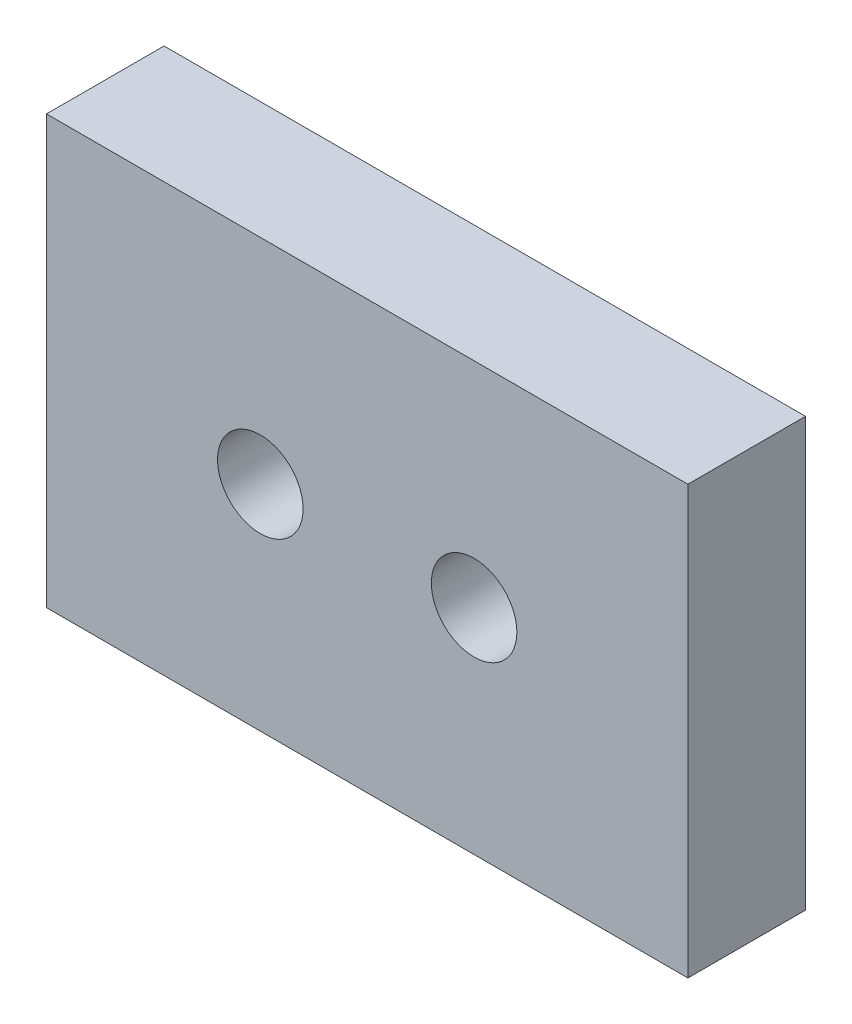
ISO-10303-21;
HEADER;
FILE_DESCRIPTION(('STEP AP214'),'2;1');
FILE_NAME('part.step','',(''),(''),'','','');
FILE_SCHEMA(('AUTOMOTIVE_DESIGN { 1 0 10303 214 1 1 1 1 }'));
ENDSEC;
DATA;
#1=APPLICATION_CONTEXT('core data for automotive mechanical design processes');
#2=APPLICATION_PROTOCOL_DEFINITION('international standard','automotive_design',2000,#1);
#3=PRODUCT_CONTEXT('',#1,'mechanical');
#4=PRODUCT('Part','Part','',(#3));
#5=PRODUCT_RELATED_PRODUCT_CATEGORY('part','',(#4));
#6=PRODUCT_DEFINITION_FORMATION('','',#4);
#7=PRODUCT_DEFINITION_CONTEXT('part definition',#1,'design');
#8=PRODUCT_DEFINITION('design','',#6,#7);
#9=PRODUCT_DEFINITION_SHAPE('','',#8);
#10=(LENGTH_UNIT() NAMED_UNIT(*) SI_UNIT(.MILLI.,.METRE.));
#11=(NAMED_UNIT(*) PLANE_ANGLE_UNIT() SI_UNIT($,.RADIAN.));
#12=(NAMED_UNIT(*) SI_UNIT($,.STERADIAN.) SOLID_ANGLE_UNIT());
#13=UNCERTAINTY_MEASURE_WITH_UNIT(LENGTH_MEASURE(1.E-05),#10,'distance_accuracy_value','');
#14=(GEOMETRIC_REPRESENTATION_CONTEXT(3) GLOBAL_UNCERTAINTY_ASSIGNED_CONTEXT((#13)) GLOBAL_UNIT_ASSIGNED_CONTEXT((#10,
#11,#12)) REPRESENTATION_CONTEXT('',''));
#15=CARTESIAN_POINT('',(0.,0.,0.));
#16=DIRECTION('',(0.,0.,1.));
#17=DIRECTION('',(1.,0.,0.));
#18=AXIS2_PLACEMENT_3D('',#15,#16,#17);
#19=CARTESIAN_POINT('',(0.,0.,11.));
#20=DIRECTION('',(0.,0.,1.));
#21=DIRECTION('',(1.,0.,0.));
#22=AXIS2_PLACEMENT_3D('',#19,#20,#21);
#23=PLANE('',#22);
#24=CARTESIAN_POINT('',(-10.,0.,11.));
#25=DIRECTION('',(0.,0.,1.));
#26=DIRECTION('',(1.,0.,0.));
#27=AXIS2_PLACEMENT_3D('',#24,#25,#26);
#28=CIRCLE('',#27,4.);
#29=CARTESIAN_POINT('',(-6.,0.,11.));
#30=VERTEX_POINT('',#29);
#31=EDGE_CURVE('E108',#30,#30,#28,.T.);
#32=ORIENTED_EDGE('',*,*,#31,.F.);
#33=EDGE_LOOP('',(#32));
#34=FACE_BOUND('',#33,.T.);
#35=DIRECTION('',(0.,-1.,0.));
#36=VECTOR('',#35,1.);
#37=CARTESIAN_POINT('',(-30.,20.,11.));
#38=LINE('',#37,#36);
#39=CARTESIAN_POINT('',(-30.,20.,11.));
#40=VERTEX_POINT('',#39);
#41=CARTESIAN_POINT('',(-30.,-20.,11.));
#42=VERTEX_POINT('',#41);
#43=EDGE_CURVE('E93',#40,#42,#38,.T.);
#44=ORIENTED_EDGE('',*,*,#43,.T.);
#45=DIRECTION('',(1.,0.,0.));
#46=VECTOR('',#45,1.);
#47=CARTESIAN_POINT('',(-30.,-20.,11.));
#48=LINE('',#47,#46);
#49=CARTESIAN_POINT('',(30.,-20.,11.));
#50=VERTEX_POINT('',#49);
#51=EDGE_CURVE('E88',#42,#50,#48,.T.);
#52=ORIENTED_EDGE('',*,*,#51,.T.);
#53=DIRECTION('',(0.,1.,0.));
#54=VECTOR('',#53,1.);
#55=CARTESIAN_POINT('',(30.,-20.,11.));
#56=LINE('',#55,#54);
#57=CARTESIAN_POINT('',(30.,20.,11.));
#58=VERTEX_POINT('',#57);
#59=EDGE_CURVE('E91',#50,#58,#56,.T.);
#60=ORIENTED_EDGE('',*,*,#59,.T.);
#61=DIRECTION('',(-1.,0.,0.));
#62=VECTOR('',#61,1.);
#63=CARTESIAN_POINT('',(30.,20.,11.));
#64=LINE('',#63,#62);
#65=EDGE_CURVE('E58',#58,#40,#64,.T.);
#66=ORIENTED_EDGE('',*,*,#65,.T.);
#67=EDGE_LOOP('',(#44,#52,#60,#66));
#68=FACE_BOUND('',#67,.T.);
#69=CARTESIAN_POINT('',(10.,0.,11.));
#70=DIRECTION('',(0.,0.,1.));
#71=DIRECTION('',(1.,0.,0.));
#72=AXIS2_PLACEMENT_3D('',#69,#70,#71);
#73=CIRCLE('',#72,4.);
#74=CARTESIAN_POINT('',(14.,0.,11.));
#75=VERTEX_POINT('',#74);
#76=EDGE_CURVE('E123',#75,#75,#73,.T.);
#77=ORIENTED_EDGE('',*,*,#76,.F.);
#78=EDGE_LOOP('',(#77));
#79=FACE_BOUND('',#78,.T.);
#80=ADVANCED_FACE('F41',(#34,#68,#79),#23,.T.);
#81=CARTESIAN_POINT('',(0.,0.,0.));
#82=DIRECTION('',(0.,0.,1.));
#83=DIRECTION('',(1.,0.,0.));
#84=AXIS2_PLACEMENT_3D('',#81,#82,#83);
#85=PLANE('',#84);
#86=DIRECTION('',(0.,-1.,0.));
#87=VECTOR('',#86,1.);
#88=CARTESIAN_POINT('',(-30.,20.,0.));
#89=LINE('',#88,#87);
#90=CARTESIAN_POINT('',(-30.,20.,0.));
#91=VERTEX_POINT('',#90);
#92=CARTESIAN_POINT('',(-30.,-20.,0.));
#93=VERTEX_POINT('',#92);
#94=EDGE_CURVE('E105',#91,#93,#89,.T.);
#95=ORIENTED_EDGE('',*,*,#94,.F.);
#96=DIRECTION('',(-1.,0.,0.));
#97=VECTOR('',#96,1.);
#98=CARTESIAN_POINT('',(30.,20.,0.));
#99=LINE('',#98,#97);
#100=CARTESIAN_POINT('',(30.,20.,0.));
#101=VERTEX_POINT('',#100);
#102=EDGE_CURVE('E81',#101,#91,#99,.T.);
#103=ORIENTED_EDGE('',*,*,#102,.F.);
#104=DIRECTION('',(0.,1.,0.));
#105=VECTOR('',#104,1.);
#106=CARTESIAN_POINT('',(30.,-20.,0.));
#107=LINE('',#106,#105);
#108=CARTESIAN_POINT('',(30.,-20.,0.));
#109=VERTEX_POINT('',#108);
#110=EDGE_CURVE('E75',#109,#101,#107,.T.);
#111=ORIENTED_EDGE('',*,*,#110,.F.);
#112=DIRECTION('',(1.,0.,0.));
#113=VECTOR('',#112,1.);
#114=CARTESIAN_POINT('',(-30.,-20.,0.));
#115=LINE('',#114,#113);
#116=EDGE_CURVE('E97',#93,#109,#115,.T.);
#117=ORIENTED_EDGE('',*,*,#116,.F.);
#118=EDGE_LOOP('',(#95,#103,#111,#117));
#119=FACE_BOUND('',#118,.T.);
#120=CARTESIAN_POINT('',(-10.,0.,0.));
#121=DIRECTION('',(0.,0.,1.));
#122=DIRECTION('',(1.,0.,0.));
#123=AXIS2_PLACEMENT_3D('',#120,#121,#122);
#124=CIRCLE('',#123,4.);
#125=CARTESIAN_POINT('',(-6.,0.,0.));
#126=VERTEX_POINT('',#125);
#127=EDGE_CURVE('E120',#126,#126,#124,.T.);
#128=ORIENTED_EDGE('',*,*,#127,.T.);
#129=EDGE_LOOP('',(#128));
#130=FACE_BOUND('',#129,.T.);
#131=CARTESIAN_POINT('',(10.,0.,0.));
#132=DIRECTION('',(0.,0.,1.));
#133=DIRECTION('',(1.,0.,0.));
#134=AXIS2_PLACEMENT_3D('',#131,#132,#133);
#135=CIRCLE('',#134,4.);
#136=CARTESIAN_POINT('',(14.,0.,0.));
#137=VERTEX_POINT('',#136);
#138=EDGE_CURVE('E126',#137,#137,#135,.T.);
#139=ORIENTED_EDGE('',*,*,#138,.T.);
#140=EDGE_LOOP('',(#139));
#141=FACE_BOUND('',#140,.T.);
#142=ADVANCED_FACE('F116',(#119,#130,#141),#85,.F.);
#143=CARTESIAN_POINT('',(-30.,20.,11.));
#144=DIRECTION('',(1.,0.,0.));
#145=DIRECTION('',(0.,0.,-1.));
#146=AXIS2_PLACEMENT_3D('',#143,#144,#145);
#147=PLANE('',#146);
#148=ORIENTED_EDGE('',*,*,#94,.T.);
#149=DIRECTION('',(0.,0.,-1.));
#150=VECTOR('',#149,1.);
#151=CARTESIAN_POINT('',(-30.,-20.,11.));
#152=LINE('',#151,#150);
#153=EDGE_CURVE('E11',#42,#93,#152,.T.);
#154=ORIENTED_EDGE('',*,*,#153,.F.);
#155=ORIENTED_EDGE('',*,*,#43,.F.);
#156=DIRECTION('',(0.,0.,-1.));
#157=VECTOR('',#156,1.);
#158=CARTESIAN_POINT('',(-30.,20.,11.));
#159=LINE('',#158,#157);
#160=EDGE_CURVE('E101',#40,#91,#159,.T.);
#161=ORIENTED_EDGE('',*,*,#160,.T.);
#162=EDGE_LOOP('',(#148,#154,#155,#161));
#163=FACE_BOUND('',#162,.T.);
#164=ADVANCED_FACE('F43',(#163),#147,.F.);
#165=CARTESIAN_POINT('',(-30.,-20.,11.));
#166=DIRECTION('',(0.,1.,0.));
#167=DIRECTION('',(0.,0.,1.));
#168=AXIS2_PLACEMENT_3D('',#165,#166,#167);
#169=PLANE('',#168);
#170=ORIENTED_EDGE('',*,*,#116,.T.);
#171=DIRECTION('',(0.,0.,-1.));
#172=VECTOR('',#171,1.);
#173=CARTESIAN_POINT('',(30.,-20.,11.));
#174=LINE('',#173,#172);
#175=EDGE_CURVE('E50',#50,#109,#174,.T.);
#176=ORIENTED_EDGE('',*,*,#175,.F.);
#177=ORIENTED_EDGE('',*,*,#51,.F.);
#178=ORIENTED_EDGE('',*,*,#153,.T.);
#179=EDGE_LOOP('',(#170,#176,#177,#178));
#180=FACE_BOUND('',#179,.T.);
#181=ADVANCED_FACE('F96',(#180),#169,.F.);
#182=CARTESIAN_POINT('',(30.,-20.,11.));
#183=DIRECTION('',(-1.,0.,0.));
#184=DIRECTION('',(0.,0.,1.));
#185=AXIS2_PLACEMENT_3D('',#182,#183,#184);
#186=PLANE('',#185);
#187=ORIENTED_EDGE('',*,*,#110,.T.);
#188=DIRECTION('',(0.,0.,-1.));
#189=VECTOR('',#188,1.);
#190=CARTESIAN_POINT('',(30.,20.,11.));
#191=LINE('',#190,#189);
#192=EDGE_CURVE('E98',#58,#101,#191,.T.);
#193=ORIENTED_EDGE('',*,*,#192,.F.);
#194=ORIENTED_EDGE('',*,*,#59,.F.);
#195=ORIENTED_EDGE('',*,*,#175,.T.);
#196=EDGE_LOOP('',(#187,#193,#194,#195));
#197=FACE_BOUND('',#196,.T.);
#198=ADVANCED_FACE('F99',(#197),#186,.F.);
#199=CARTESIAN_POINT('',(30.,20.,11.));
#200=DIRECTION('',(0.,-1.,0.));
#201=DIRECTION('',(0.,0.,-1.));
#202=AXIS2_PLACEMENT_3D('',#199,#200,#201);
#203=PLANE('',#202);
#204=ORIENTED_EDGE('',*,*,#102,.T.);
#205=ORIENTED_EDGE('',*,*,#160,.F.);
#206=ORIENTED_EDGE('',*,*,#65,.F.);
#207=ORIENTED_EDGE('',*,*,#192,.T.);
#208=EDGE_LOOP('',(#204,#205,#206,#207));
#209=FACE_BOUND('',#208,.T.);
#210=ADVANCED_FACE('F113',(#209),#203,.F.);
#211=CARTESIAN_POINT('',(-10.,0.,11.));
#212=DIRECTION('',(0.,0.,-1.));
#213=DIRECTION('',(-1.,0.,0.));
#214=AXIS2_PLACEMENT_3D('',#211,#212,#213);
#215=CYLINDRICAL_SURFACE('',#214,4.);
#216=ORIENTED_EDGE('',*,*,#31,.T.);
#217=EDGE_LOOP('',(#216));
#218=FACE_BOUND('',#217,.T.);
#219=ORIENTED_EDGE('',*,*,#127,.F.);
#220=EDGE_LOOP('',(#219));
#221=FACE_BOUND('',#220,.T.);
#222=ADVANCED_FACE('F143',(#218,#221),#215,.F.);
#223=CARTESIAN_POINT('',(10.,0.,11.));
#224=DIRECTION('',(0.,0.,-1.));
#225=DIRECTION('',(-1.,0.,0.));
#226=AXIS2_PLACEMENT_3D('',#223,#224,#225);
#227=CYLINDRICAL_SURFACE('',#226,4.);
#228=ORIENTED_EDGE('',*,*,#76,.T.);
#229=EDGE_LOOP('',(#228));
#230=FACE_BOUND('',#229,.T.);
#231=ORIENTED_EDGE('',*,*,#138,.F.);
#232=EDGE_LOOP('',(#231));
#233=FACE_BOUND('',#232,.T.);
#234=ADVANCED_FACE('F132',(#230,#233),#227,.F.);
#235=CLOSED_SHELL('',(#80,#142,#164,#181,#198,#210,#222,#234));
#236=MANIFOLD_SOLID_BREP('B2',#235);
#237=ADVANCED_BREP_SHAPE_REPRESENTATION('',(#18,#236),#14);
#238=SHAPE_DEFINITION_REPRESENTATION(#9,#237);
ENDSEC;
END-ISO-10303-21;
